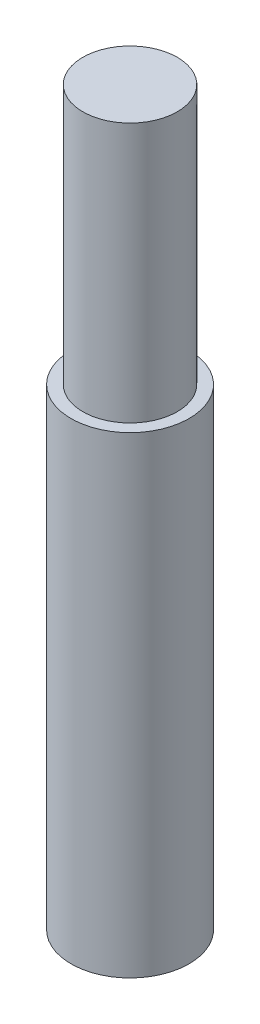
ISO-10303-21;
HEADER;
FILE_DESCRIPTION(('STEP AP214'),'2;1');
FILE_NAME('part.step','',(''),(''),'','','');
FILE_SCHEMA(('AUTOMOTIVE_DESIGN { 1 0 10303 214 1 1 1 1 }'));
ENDSEC;
DATA;
#1=APPLICATION_CONTEXT('core data for automotive mechanical design processes');
#2=APPLICATION_PROTOCOL_DEFINITION('international standard','automotive_design',2000,#1);
#3=PRODUCT_CONTEXT('',#1,'mechanical');
#4=PRODUCT('Part','Part','',(#3));
#5=PRODUCT_RELATED_PRODUCT_CATEGORY('part','',(#4));
#6=PRODUCT_DEFINITION_FORMATION('','',#4);
#7=PRODUCT_DEFINITION_CONTEXT('part definition',#1,'design');
#8=PRODUCT_DEFINITION('design','',#6,#7);
#9=PRODUCT_DEFINITION_SHAPE('','',#8);
#10=(LENGTH_UNIT() NAMED_UNIT(*) SI_UNIT(.MILLI.,.METRE.));
#11=(NAMED_UNIT(*) PLANE_ANGLE_UNIT() SI_UNIT($,.RADIAN.));
#12=(NAMED_UNIT(*) SI_UNIT($,.STERADIAN.) SOLID_ANGLE_UNIT());
#13=UNCERTAINTY_MEASURE_WITH_UNIT(LENGTH_MEASURE(1.E-05),#10,'distance_accuracy_value','');
#14=(GEOMETRIC_REPRESENTATION_CONTEXT(3) GLOBAL_UNCERTAINTY_ASSIGNED_CONTEXT((#13)) GLOBAL_UNIT_ASSIGNED_CONTEXT((#10,
#11,#12)) REPRESENTATION_CONTEXT('',''));
#15=CARTESIAN_POINT('',(0.,0.,0.));
#16=DIRECTION('',(0.,0.,1.));
#17=DIRECTION('',(1.,0.,0.));
#18=AXIS2_PLACEMENT_3D('',#15,#16,#17);
#19=CARTESIAN_POINT('',(0.,0.399999999999999,0.));
#20=DIRECTION('',(0.,-1.,0.));
#21=DIRECTION('',(0.,0.,-1.));
#22=AXIS2_PLACEMENT_3D('',#19,#20,#21);
#23=TOROIDAL_SURFACE('',#22,2.4,0.4);
#24=CARTESIAN_POINT('',(0.,0.,0.));
#25=DIRECTION('',(0.,-1.,0.));
#26=DIRECTION('',(0.,0.,-1.));
#27=AXIS2_PLACEMENT_3D('',#24,#25,#26);
#28=CIRCLE('',#27,2.4);
#29=CARTESIAN_POINT('',(0.,0.,-2.4));
#30=VERTEX_POINT('',#29);
#31=EDGE_CURVE('E37',#30,#30,#28,.F.);
#32=ORIENTED_EDGE('',*,*,#31,.F.);
#33=EDGE_LOOP('',(#32));
#34=FACE_BOUND('',#33,.T.);
#35=CARTESIAN_POINT('',(0.,0.399999999999999,0.));
#36=DIRECTION('',(0.,-1.,0.));
#37=DIRECTION('',(0.,0.,-1.));
#38=AXIS2_PLACEMENT_3D('',#35,#36,#37);
#39=CIRCLE('',#38,2.);
#40=CARTESIAN_POINT('',(0.,0.399999999999999,-2.));
#41=VERTEX_POINT('',#40);
#42=EDGE_CURVE('E10',#41,#41,#39,.T.);
#43=ORIENTED_EDGE('',*,*,#42,.F.);
#44=EDGE_LOOP('',(#43));
#45=FACE_BOUND('',#44,.T.);
#46=ADVANCED_FACE('F31',(#34,#45),#23,.T.);
#47=CARTESIAN_POINT('',(2.5,0.,0.));
#48=DIRECTION('',(0.,-1.,0.));
#49=DIRECTION('',(0.,0.,-1.));
#50=AXIS2_PLACEMENT_3D('',#47,#48,#49);
#51=PLANE('',#50);
#52=ORIENTED_EDGE('',*,*,#31,.T.);
#53=EDGE_LOOP('',(#52));
#54=FACE_BOUND('',#53,.T.);
#55=CARTESIAN_POINT('',(0.,0.,0.));
#56=DIRECTION('',(0.,-1.,0.));
#57=DIRECTION('',(0.,0.,-1.));
#58=AXIS2_PLACEMENT_3D('',#55,#56,#57);
#59=CIRCLE('',#58,2.5);
#60=CARTESIAN_POINT('',(0.,0.,-2.5));
#61=VERTEX_POINT('',#60);
#62=EDGE_CURVE('E53',#61,#61,#59,.T.);
#63=ORIENTED_EDGE('',*,*,#62,.T.);
#64=EDGE_LOOP('',(#63));
#65=FACE_BOUND('',#64,.T.);
#66=ADVANCED_FACE('F75',(#54,#65),#51,.T.);
#67=CARTESIAN_POINT('',(0.,31.,0.));
#68=DIRECTION('',(0.,1.,0.));
#69=DIRECTION('',(0.,0.,1.));
#70=AXIS2_PLACEMENT_3D('',#67,#68,#69);
#71=PLANE('',#70);
#72=CARTESIAN_POINT('',(0.,31.,0.));
#73=DIRECTION('',(0.,-1.,0.));
#74=DIRECTION('',(0.,0.,-1.));
#75=AXIS2_PLACEMENT_3D('',#72,#73,#74);
#76=CIRCLE('',#75,2.);
#77=CARTESIAN_POINT('',(0.,31.,-2.));
#78=VERTEX_POINT('',#77);
#79=EDGE_CURVE('E41',#78,#78,#76,.T.);
#80=ORIENTED_EDGE('',*,*,#79,.F.);
#81=EDGE_LOOP('',(#80));
#82=FACE_BOUND('',#81,.T.);
#83=ADVANCED_FACE('F80',(#82),#71,.T.);
#84=CARTESIAN_POINT('',(0.,0.,0.));
#85=DIRECTION('',(0.,-1.,0.));
#86=DIRECTION('',(0.,0.,-1.));
#87=AXIS2_PLACEMENT_3D('',#84,#85,#86);
#88=CYLINDRICAL_SURFACE('',#87,2.);
#89=ORIENTED_EDGE('',*,*,#79,.T.);
#90=EDGE_LOOP('',(#89));
#91=FACE_BOUND('',#90,.T.);
#92=CARTESIAN_POINT('',(0.,20.,0.));
#93=DIRECTION('',(0.,-1.,0.));
#94=DIRECTION('',(0.,0.,-1.));
#95=AXIS2_PLACEMENT_3D('',#92,#93,#94);
#96=CIRCLE('',#95,2.);
#97=CARTESIAN_POINT('',(0.,20.,-2.));
#98=VERTEX_POINT('',#97);
#99=EDGE_CURVE('E45',#98,#98,#96,.T.);
#100=ORIENTED_EDGE('',*,*,#99,.F.);
#101=EDGE_LOOP('',(#100));
#102=FACE_BOUND('',#101,.T.);
#103=ADVANCED_FACE('F85',(#91,#102),#88,.T.);
#104=CARTESIAN_POINT('',(2.,20.,0.));
#105=DIRECTION('',(0.,1.,0.));
#106=DIRECTION('',(0.,0.,1.));
#107=AXIS2_PLACEMENT_3D('',#104,#105,#106);
#108=PLANE('',#107);
#109=ORIENTED_EDGE('',*,*,#99,.T.);
#110=EDGE_LOOP('',(#109));
#111=FACE_BOUND('',#110,.T.);
#112=CARTESIAN_POINT('',(0.,20.,0.));
#113=DIRECTION('',(0.,-1.,0.));
#114=DIRECTION('',(0.,0.,-1.));
#115=AXIS2_PLACEMENT_3D('',#112,#113,#114);
#116=CIRCLE('',#115,2.5);
#117=CARTESIAN_POINT('',(0.,20.,-2.5));
#118=VERTEX_POINT('',#117);
#119=EDGE_CURVE('E50',#118,#118,#116,.T.);
#120=ORIENTED_EDGE('',*,*,#119,.F.);
#121=EDGE_LOOP('',(#120));
#122=FACE_BOUND('',#121,.T.);
#123=ADVANCED_FACE('F71',(#111,#122),#108,.T.);
#124=CARTESIAN_POINT('',(0.,0.,0.));
#125=DIRECTION('',(0.,-1.,0.));
#126=DIRECTION('',(0.,0.,-1.));
#127=AXIS2_PLACEMENT_3D('',#124,#125,#126);
#128=CYLINDRICAL_SURFACE('',#127,2.5);
#129=ORIENTED_EDGE('',*,*,#119,.T.);
#130=EDGE_LOOP('',(#129));
#131=FACE_BOUND('',#130,.T.);
#132=ORIENTED_EDGE('',*,*,#62,.F.);
#133=EDGE_LOOP('',(#132));
#134=FACE_BOUND('',#133,.T.);
#135=ADVANCED_FACE('F64',(#131,#134),#128,.T.);
#136=CARTESIAN_POINT('',(0.,10.,0.));
#137=DIRECTION('',(0.,-1.,0.));
#138=DIRECTION('',(0.,0.,-1.));
#139=AXIS2_PLACEMENT_3D('',#136,#137,#138);
#140=CYLINDRICAL_SURFACE('',#139,2.);
#141=ORIENTED_EDGE('',*,*,#42,.T.);
#142=EDGE_LOOP('',(#141));
#143=FACE_BOUND('',#142,.T.);
#144=CARTESIAN_POINT('',(0.,10.,0.));
#145=DIRECTION('',(0.,-1.,0.));
#146=DIRECTION('',(0.,0.,-1.));
#147=AXIS2_PLACEMENT_3D('',#144,#145,#146);
#148=CIRCLE('',#147,2.);
#149=CARTESIAN_POINT('',(0.,10.,-2.));
#150=VERTEX_POINT('',#149);
#151=EDGE_CURVE('E56',#150,#150,#148,.T.);
#152=ORIENTED_EDGE('',*,*,#151,.F.);
#153=EDGE_LOOP('',(#152));
#154=FACE_BOUND('',#153,.T.);
#155=ADVANCED_FACE('F62',(#143,#154),#140,.F.);
#156=CARTESIAN_POINT('',(0.,10.,0.));
#157=DIRECTION('',(0.,-1.,0.));
#158=DIRECTION('',(0.,0.,-1.));
#159=AXIS2_PLACEMENT_3D('',#156,#157,#158);
#160=PLANE('',#159);
#161=ORIENTED_EDGE('',*,*,#151,.T.);
#162=EDGE_LOOP('',(#161));
#163=FACE_BOUND('',#162,.T.);
#164=ADVANCED_FACE('F60',(#163),#160,.T.);
#165=CLOSED_SHELL('',(#46,#66,#83,#103,#123,#135,#155,#164));
#166=MANIFOLD_SOLID_BREP('B2',#165);
#167=ADVANCED_BREP_SHAPE_REPRESENTATION('',(#18,#166),#14);
#168=SHAPE_DEFINITION_REPRESENTATION(#9,#167);
ENDSEC;
END-ISO-10303-21;
